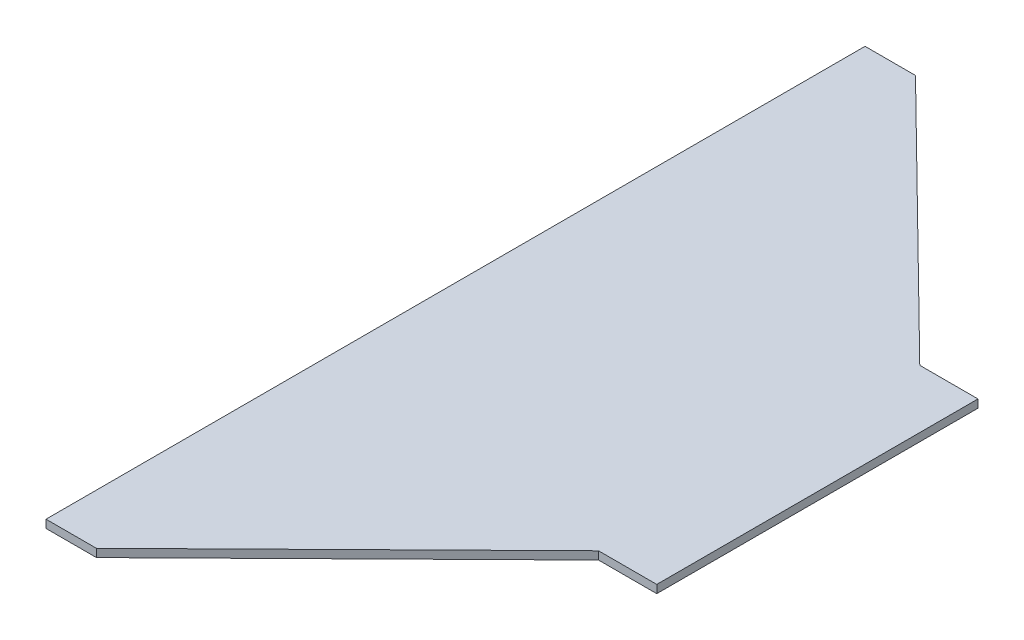
ISO-10303-21;
HEADER;
FILE_DESCRIPTION(('STEP AP214'),'2;1');
FILE_NAME('part.step','',(''),(''),'','','');
FILE_SCHEMA(('AUTOMOTIVE_DESIGN { 1 0 10303 214 1 1 1 1 }'));
ENDSEC;
DATA;
#1=APPLICATION_CONTEXT('core data for automotive mechanical design processes');
#2=APPLICATION_PROTOCOL_DEFINITION('international standard','automotive_design',2000,#1);
#3=PRODUCT_CONTEXT('',#1,'mechanical');
#4=PRODUCT('Part','Part','',(#3));
#5=PRODUCT_RELATED_PRODUCT_CATEGORY('part','',(#4));
#6=PRODUCT_DEFINITION_FORMATION('','',#4);
#7=PRODUCT_DEFINITION_CONTEXT('part definition',#1,'design');
#8=PRODUCT_DEFINITION('design','',#6,#7);
#9=PRODUCT_DEFINITION_SHAPE('','',#8);
#10=(LENGTH_UNIT() NAMED_UNIT(*) SI_UNIT(.MILLI.,.METRE.));
#11=(NAMED_UNIT(*) PLANE_ANGLE_UNIT() SI_UNIT($,.RADIAN.));
#12=(NAMED_UNIT(*) SI_UNIT($,.STERADIAN.) SOLID_ANGLE_UNIT());
#13=UNCERTAINTY_MEASURE_WITH_UNIT(LENGTH_MEASURE(1.E-05),#10,'distance_accuracy_value','');
#14=(GEOMETRIC_REPRESENTATION_CONTEXT(3) GLOBAL_UNCERTAINTY_ASSIGNED_CONTEXT((#13)) GLOBAL_UNIT_ASSIGNED_CONTEXT((#10,
#11,#12)) REPRESENTATION_CONTEXT('',''));
#15=CARTESIAN_POINT('',(0.,0.,0.));
#16=DIRECTION('',(0.,0.,1.));
#17=DIRECTION('',(1.,0.,0.));
#18=AXIS2_PLACEMENT_3D('',#15,#16,#17);
#19=CARTESIAN_POINT('',(6.27,1.,0.));
#20=DIRECTION('',(0.,0.,1.));
#21=DIRECTION('',(1.,0.,0.));
#22=AXIS2_PLACEMENT_3D('',#19,#20,#21);
#23=PLANE('',#22);
#24=DIRECTION('',(-1.,0.,0.));
#25=VECTOR('',#24,1.);
#26=CARTESIAN_POINT('',(6.27,0.,0.));
#27=LINE('',#26,#25);
#28=CARTESIAN_POINT('',(6.27,0.,0.));
#29=VERTEX_POINT('',#28);
#30=CARTESIAN_POINT('',(0.,0.,0.));
#31=VERTEX_POINT('',#30);
#32=EDGE_CURVE('E132',#29,#31,#27,.T.);
#33=ORIENTED_EDGE('',*,*,#32,.T.);
#34=DIRECTION('',(0.,-1.,0.));
#35=VECTOR('',#34,1.);
#36=CARTESIAN_POINT('',(0.,1.,0.));
#37=LINE('',#36,#35);
#38=CARTESIAN_POINT('',(0.,1.,0.));
#39=VERTEX_POINT('',#38);
#40=EDGE_CURVE('E11',#39,#31,#37,.T.);
#41=ORIENTED_EDGE('',*,*,#40,.F.);
#42=DIRECTION('',(-1.,0.,0.));
#43=VECTOR('',#42,1.);
#44=CARTESIAN_POINT('',(6.27,1.,0.));
#45=LINE('',#44,#43);
#46=CARTESIAN_POINT('',(6.27,1.,0.));
#47=VERTEX_POINT('',#46);
#48=EDGE_CURVE('E149',#47,#39,#45,.T.);
#49=ORIENTED_EDGE('',*,*,#48,.F.);
#50=DIRECTION('',(0.,-1.,0.));
#51=VECTOR('',#50,1.);
#52=CARTESIAN_POINT('',(6.27,1.,0.));
#53=LINE('',#52,#51);
#54=EDGE_CURVE('E134',#47,#29,#53,.T.);
#55=ORIENTED_EDGE('',*,*,#54,.T.);
#56=EDGE_LOOP('',(#33,#41,#49,#55));
#57=FACE_BOUND('',#56,.T.);
#58=ADVANCED_FACE('F39',(#57),#23,.F.);
#59=CARTESIAN_POINT('',(0.,1.,0.));
#60=DIRECTION('',(1.,0.,0.));
#61=DIRECTION('',(0.,0.,-1.));
#62=AXIS2_PLACEMENT_3D('',#59,#60,#61);
#63=PLANE('',#62);
#64=DIRECTION('',(0.,0.,1.));
#65=VECTOR('',#64,1.);
#66=CARTESIAN_POINT('',(0.,0.,0.));
#67=LINE('',#66,#65);
#68=CARTESIAN_POINT('',(0.,0.,101.83));
#69=VERTEX_POINT('',#68);
#70=EDGE_CURVE('E136',#31,#69,#67,.T.);
#71=ORIENTED_EDGE('',*,*,#70,.T.);
#72=DIRECTION('',(0.,-1.,0.));
#73=VECTOR('',#72,1.);
#74=CARTESIAN_POINT('',(0.,1.,101.83));
#75=LINE('',#74,#73);
#76=CARTESIAN_POINT('',(0.,1.,101.83));
#77=VERTEX_POINT('',#76);
#78=EDGE_CURVE('E50',#77,#69,#75,.T.);
#79=ORIENTED_EDGE('',*,*,#78,.F.);
#80=DIRECTION('',(0.,0.,1.));
#81=VECTOR('',#80,1.);
#82=CARTESIAN_POINT('',(0.,1.,0.));
#83=LINE('',#82,#81);
#84=EDGE_CURVE('E98',#39,#77,#83,.T.);
#85=ORIENTED_EDGE('',*,*,#84,.F.);
#86=ORIENTED_EDGE('',*,*,#40,.T.);
#87=EDGE_LOOP('',(#71,#79,#85,#86));
#88=FACE_BOUND('',#87,.T.);
#89=ADVANCED_FACE('F184',(#88),#63,.F.);
#90=CARTESIAN_POINT('',(0.,1.,101.83));
#91=DIRECTION('',(0.,0.,-1.));
#92=DIRECTION('',(-1.,0.,0.));
#93=AXIS2_PLACEMENT_3D('',#90,#91,#92);
#94=PLANE('',#93);
#95=DIRECTION('',(1.,0.,0.));
#96=VECTOR('',#95,1.);
#97=CARTESIAN_POINT('',(0.,0.,101.83));
#98=LINE('',#97,#96);
#99=CARTESIAN_POINT('',(6.27,0.,101.83));
#100=VERTEX_POINT('',#99);
#101=EDGE_CURVE('E137',#69,#100,#98,.T.);
#102=ORIENTED_EDGE('',*,*,#101,.T.);
#103=DIRECTION('',(0.,-1.,0.));
#104=VECTOR('',#103,1.);
#105=CARTESIAN_POINT('',(6.27,1.,101.83));
#106=LINE('',#105,#104);
#107=CARTESIAN_POINT('',(6.27,1.,101.83));
#108=VERTEX_POINT('',#107);
#109=EDGE_CURVE('E156',#108,#100,#106,.T.);
#110=ORIENTED_EDGE('',*,*,#109,.F.);
#111=DIRECTION('',(1.,0.,0.));
#112=VECTOR('',#111,1.);
#113=CARTESIAN_POINT('',(0.,1.,101.83));
#114=LINE('',#113,#112);
#115=EDGE_CURVE('E163',#77,#108,#114,.T.);
#116=ORIENTED_EDGE('',*,*,#115,.F.);
#117=ORIENTED_EDGE('',*,*,#78,.T.);
#118=EDGE_LOOP('',(#102,#110,#116,#117));
#119=FACE_BOUND('',#118,.T.);
#120=ADVANCED_FACE('F165',(#119),#94,.F.);
#121=CARTESIAN_POINT('',(6.27,1.,101.83));
#122=DIRECTION('',(-0.701033739311053,0.,-0.713128106547178));
#123=DIRECTION('',(-0.713128106547178,0.,0.701033739311053));
#124=AXIS2_PLACEMENT_3D('',#121,#122,#123);
#125=PLANE('',#124);
#126=DIRECTION('',(0.713128106547178,0.,-0.701033739311053));
#127=VECTOR('',#126,1.);
#128=CARTESIAN_POINT('',(6.27,0.,101.83));
#129=LINE('',#128,#127);
#130=CARTESIAN_POINT('',(37.7488690181869,0.,70.885));
#131=VERTEX_POINT('',#130);
#132=EDGE_CURVE('E142',#100,#131,#129,.T.);
#133=ORIENTED_EDGE('',*,*,#132,.T.);
#134=DIRECTION('',(0.,-1.,0.));
#135=VECTOR('',#134,1.);
#136=CARTESIAN_POINT('',(37.7488690181869,1.,70.885));
#137=LINE('',#136,#135);
#138=CARTESIAN_POINT('',(37.7488690181869,1.,70.885));
#139=VERTEX_POINT('',#138);
#140=EDGE_CURVE('E153',#139,#131,#137,.T.);
#141=ORIENTED_EDGE('',*,*,#140,.F.);
#142=DIRECTION('',(0.713128106547178,0.,-0.701033739311053));
#143=VECTOR('',#142,1.);
#144=CARTESIAN_POINT('',(6.27,1.,101.83));
#145=LINE('',#144,#143);
#146=EDGE_CURVE('E178',#108,#139,#145,.T.);
#147=ORIENTED_EDGE('',*,*,#146,.F.);
#148=ORIENTED_EDGE('',*,*,#109,.T.);
#149=EDGE_LOOP('',(#133,#141,#147,#148));
#150=FACE_BOUND('',#149,.T.);
#151=ADVANCED_FACE('F171',(#150),#125,.F.);
#152=CARTESIAN_POINT('',(37.7488690181869,1.,70.885));
#153=DIRECTION('',(0.,0.,-1.));
#154=DIRECTION('',(-1.,0.,0.));
#155=AXIS2_PLACEMENT_3D('',#152,#153,#154);
#156=PLANE('',#155);
#157=DIRECTION('',(1.,0.,0.));
#158=VECTOR('',#157,1.);
#159=CARTESIAN_POINT('',(37.7488690181869,0.,70.885));
#160=LINE('',#159,#158);
#161=CARTESIAN_POINT('',(44.9888690181869,0.,70.885));
#162=VERTEX_POINT('',#161);
#163=EDGE_CURVE('E145',#131,#162,#160,.T.);
#164=ORIENTED_EDGE('',*,*,#163,.T.);
#165=DIRECTION('',(0.,-1.,0.));
#166=VECTOR('',#165,1.);
#167=CARTESIAN_POINT('',(44.9888690181869,1.,70.885));
#168=LINE('',#167,#166);
#169=CARTESIAN_POINT('',(44.9888690181869,1.,70.885));
#170=VERTEX_POINT('',#169);
#171=EDGE_CURVE('E127',#170,#162,#168,.T.);
#172=ORIENTED_EDGE('',*,*,#171,.F.);
#173=DIRECTION('',(1.,0.,0.));
#174=VECTOR('',#173,1.);
#175=CARTESIAN_POINT('',(37.7488690181869,1.,70.885));
#176=LINE('',#175,#174);
#177=EDGE_CURVE('E116',#139,#170,#176,.T.);
#178=ORIENTED_EDGE('',*,*,#177,.F.);
#179=ORIENTED_EDGE('',*,*,#140,.T.);
#180=EDGE_LOOP('',(#164,#172,#178,#179));
#181=FACE_BOUND('',#180,.T.);
#182=ADVANCED_FACE('F172',(#181),#156,.F.);
#183=CARTESIAN_POINT('',(44.9888690181869,1.,70.885));
#184=DIRECTION('',(-1.,0.,0.));
#185=DIRECTION('',(0.,0.,1.));
#186=AXIS2_PLACEMENT_3D('',#183,#184,#185);
#187=PLANE('',#186);
#188=DIRECTION('',(0.,0.,-1.));
#189=VECTOR('',#188,1.);
#190=CARTESIAN_POINT('',(44.9888690181869,0.,70.885));
#191=LINE('',#190,#189);
#192=CARTESIAN_POINT('',(44.9888690181869,0.,30.945));
#193=VERTEX_POINT('',#192);
#194=EDGE_CURVE('E122',#162,#193,#191,.T.);
#195=ORIENTED_EDGE('',*,*,#194,.T.);
#196=DIRECTION('',(0.,-1.,0.));
#197=VECTOR('',#196,1.);
#198=CARTESIAN_POINT('',(44.9888690181869,1.,30.945));
#199=LINE('',#198,#197);
#200=CARTESIAN_POINT('',(44.9888690181869,1.,30.945));
#201=VERTEX_POINT('',#200);
#202=EDGE_CURVE('E125',#201,#193,#199,.T.);
#203=ORIENTED_EDGE('',*,*,#202,.F.);
#204=DIRECTION('',(0.,0.,-1.));
#205=VECTOR('',#204,1.);
#206=CARTESIAN_POINT('',(44.9888690181869,1.,70.885));
#207=LINE('',#206,#205);
#208=EDGE_CURVE('E112',#170,#201,#207,.T.);
#209=ORIENTED_EDGE('',*,*,#208,.F.);
#210=ORIENTED_EDGE('',*,*,#171,.T.);
#211=EDGE_LOOP('',(#195,#203,#209,#210));
#212=FACE_BOUND('',#211,.T.);
#213=ADVANCED_FACE('F121',(#212),#187,.F.);
#214=CARTESIAN_POINT('',(44.9888690181869,1.,30.945));
#215=DIRECTION('',(0.,0.,1.));
#216=DIRECTION('',(1.,0.,0.));
#217=AXIS2_PLACEMENT_3D('',#214,#215,#216);
#218=PLANE('',#217);
#219=DIRECTION('',(-1.,0.,0.));
#220=VECTOR('',#219,1.);
#221=CARTESIAN_POINT('',(44.9888690181869,0.,30.945));
#222=LINE('',#221,#220);
#223=CARTESIAN_POINT('',(37.7488690181869,0.,30.945));
#224=VERTEX_POINT('',#223);
#225=EDGE_CURVE('E84',#193,#224,#222,.T.);
#226=ORIENTED_EDGE('',*,*,#225,.T.);
#227=DIRECTION('',(0.,-1.,0.));
#228=VECTOR('',#227,1.);
#229=CARTESIAN_POINT('',(37.7488690181869,1.,30.945));
#230=LINE('',#229,#228);
#231=CARTESIAN_POINT('',(37.7488690181869,1.,30.945));
#232=VERTEX_POINT('',#231);
#233=EDGE_CURVE('E130',#232,#224,#230,.T.);
#234=ORIENTED_EDGE('',*,*,#233,.F.);
#235=DIRECTION('',(-1.,0.,0.));
#236=VECTOR('',#235,1.);
#237=CARTESIAN_POINT('',(44.9888690181869,1.,30.945));
#238=LINE('',#237,#236);
#239=EDGE_CURVE('E113',#201,#232,#238,.T.);
#240=ORIENTED_EDGE('',*,*,#239,.F.);
#241=ORIENTED_EDGE('',*,*,#202,.T.);
#242=EDGE_LOOP('',(#226,#234,#240,#241));
#243=FACE_BOUND('',#242,.T.);
#244=ADVANCED_FACE('F129',(#243),#218,.F.);
#245=CARTESIAN_POINT('',(37.7488690181869,1.,30.945));
#246=DIRECTION('',(-0.701033739311053,0.,0.713128106547178));
#247=DIRECTION('',(0.713128106547178,0.,0.701033739311053));
#248=AXIS2_PLACEMENT_3D('',#245,#246,#247);
#249=PLANE('',#248);
#250=DIRECTION('',(-0.713128106547178,0.,-0.701033739311053));
#251=VECTOR('',#250,1.);
#252=CARTESIAN_POINT('',(37.7488690181869,0.,30.945));
#253=LINE('',#252,#251);
#254=EDGE_CURVE('E89',#224,#29,#253,.T.);
#255=ORIENTED_EDGE('',*,*,#254,.T.);
#256=ORIENTED_EDGE('',*,*,#54,.F.);
#257=DIRECTION('',(-0.713128106547178,0.,-0.701033739311053));
#258=VECTOR('',#257,1.);
#259=CARTESIAN_POINT('',(37.7488690181869,1.,30.945));
#260=LINE('',#259,#258);
#261=EDGE_CURVE('E54',#232,#47,#260,.T.);
#262=ORIENTED_EDGE('',*,*,#261,.F.);
#263=ORIENTED_EDGE('',*,*,#233,.T.);
#264=EDGE_LOOP('',(#255,#256,#262,#263));
#265=FACE_BOUND('',#264,.T.);
#266=ADVANCED_FACE('F199',(#265),#249,.F.);
#267=CARTESIAN_POINT('',(0.,1.,0.));
#268=DIRECTION('',(0.,1.,0.));
#269=DIRECTION('',(0.,0.,1.));
#270=AXIS2_PLACEMENT_3D('',#267,#268,#269);
#271=PLANE('',#270);
#272=ORIENTED_EDGE('',*,*,#48,.T.);
#273=ORIENTED_EDGE('',*,*,#84,.T.);
#274=ORIENTED_EDGE('',*,*,#115,.T.);
#275=ORIENTED_EDGE('',*,*,#146,.T.);
#276=ORIENTED_EDGE('',*,*,#177,.T.);
#277=ORIENTED_EDGE('',*,*,#208,.T.);
#278=ORIENTED_EDGE('',*,*,#239,.T.);
#279=ORIENTED_EDGE('',*,*,#261,.T.);
#280=EDGE_LOOP('',(#272,#273,#274,#275,#276,#277,#278,#279));
#281=FACE_BOUND('',#280,.T.);
#282=ADVANCED_FACE('F114',(#281),#271,.T.);
#283=CARTESIAN_POINT('',(0.,0.,0.));
#284=DIRECTION('',(0.,1.,0.));
#285=DIRECTION('',(0.,0.,1.));
#286=AXIS2_PLACEMENT_3D('',#283,#284,#285);
#287=PLANE('',#286);
#288=ORIENTED_EDGE('',*,*,#32,.F.);
#289=ORIENTED_EDGE('',*,*,#254,.F.);
#290=ORIENTED_EDGE('',*,*,#225,.F.);
#291=ORIENTED_EDGE('',*,*,#194,.F.);
#292=ORIENTED_EDGE('',*,*,#163,.F.);
#293=ORIENTED_EDGE('',*,*,#132,.F.);
#294=ORIENTED_EDGE('',*,*,#101,.F.);
#295=ORIENTED_EDGE('',*,*,#70,.F.);
#296=EDGE_LOOP('',(#288,#289,#290,#291,#292,#293,#294,#295));
#297=FACE_BOUND('',#296,.T.);
#298=ADVANCED_FACE('F169',(#297),#287,.F.);
#299=CLOSED_SHELL('',(#58,#89,#120,#151,#182,#213,#244,#266,#282,#298));
#300=MANIFOLD_SOLID_BREP('B2',#299);
#301=ADVANCED_BREP_SHAPE_REPRESENTATION('',(#18,#300),#14);
#302=SHAPE_DEFINITION_REPRESENTATION(#9,#301);
ENDSEC;
END-ISO-10303-21;
